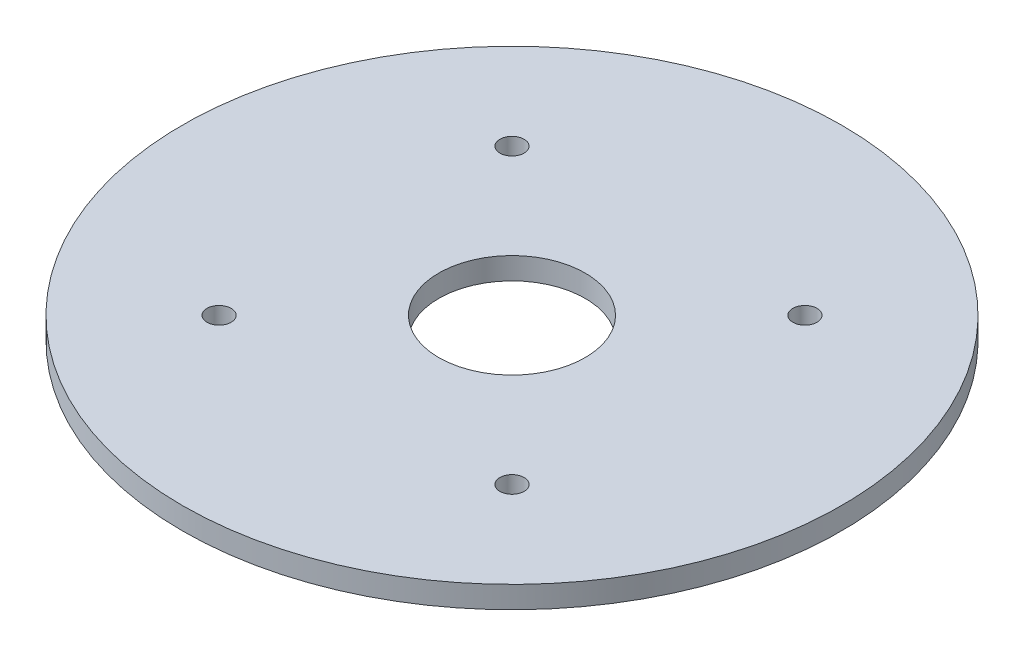
ISO-10303-21;
HEADER;
FILE_DESCRIPTION(('STEP AP214'),'2;1');
FILE_NAME('part.step','',(''),(''),'','','');
FILE_SCHEMA(('AUTOMOTIVE_DESIGN { 1 0 10303 214 1 1 1 1 }'));
ENDSEC;
DATA;
#1=APPLICATION_CONTEXT('core data for automotive mechanical design processes');
#2=APPLICATION_PROTOCOL_DEFINITION('international standard','automotive_design',2000,#1);
#3=PRODUCT_CONTEXT('',#1,'mechanical');
#4=PRODUCT('Part','Part','',(#3));
#5=PRODUCT_RELATED_PRODUCT_CATEGORY('part','',(#4));
#6=PRODUCT_DEFINITION_FORMATION('','',#4);
#7=PRODUCT_DEFINITION_CONTEXT('part definition',#1,'design');
#8=PRODUCT_DEFINITION('design','',#6,#7);
#9=PRODUCT_DEFINITION_SHAPE('','',#8);
#10=(LENGTH_UNIT() NAMED_UNIT(*) SI_UNIT(.MILLI.,.METRE.));
#11=(NAMED_UNIT(*) PLANE_ANGLE_UNIT() SI_UNIT($,.RADIAN.));
#12=(NAMED_UNIT(*) SI_UNIT($,.STERADIAN.) SOLID_ANGLE_UNIT());
#13=UNCERTAINTY_MEASURE_WITH_UNIT(LENGTH_MEASURE(1.E-05),#10,'distance_accuracy_value','');
#14=(GEOMETRIC_REPRESENTATION_CONTEXT(3) GLOBAL_UNCERTAINTY_ASSIGNED_CONTEXT((#13)) GLOBAL_UNIT_ASSIGNED_CONTEXT((#10,
#11,#12)) REPRESENTATION_CONTEXT('',''));
#15=CARTESIAN_POINT('',(0.,0.,0.));
#16=DIRECTION('',(0.,0.,1.));
#17=DIRECTION('',(1.,0.,0.));
#18=AXIS2_PLACEMENT_3D('',#15,#16,#17);
#19=CARTESIAN_POINT('',(0.,1.5,0.));
#20=DIRECTION('',(0.,1.,0.));
#21=DIRECTION('',(0.,0.,1.));
#22=AXIS2_PLACEMENT_3D('',#19,#20,#21);
#23=PLANE('',#22);
#24=CARTESIAN_POINT('',(20.,1.5,20.));
#25=DIRECTION('',(0.,1.,0.));
#26=DIRECTION('',(0.,0.,1.));
#27=AXIS2_PLACEMENT_3D('',#24,#25,#26);
#28=CIRCLE('',#27,1.65);
#29=CARTESIAN_POINT('',(20.,1.5,21.65));
#30=VERTEX_POINT('',#29);
#31=EDGE_CURVE('E96',#30,#30,#28,.T.);
#32=ORIENTED_EDGE('',*,*,#31,.F.);
#33=EDGE_LOOP('',(#32));
#34=FACE_BOUND('',#33,.T.);
#35=CARTESIAN_POINT('',(20.,1.5,-20.));
#36=DIRECTION('',(0.,1.,0.));
#37=DIRECTION('',(0.,0.,1.));
#38=AXIS2_PLACEMENT_3D('',#35,#36,#37);
#39=CIRCLE('',#38,1.65);
#40=CARTESIAN_POINT('',(20.,1.5,-18.35));
#41=VERTEX_POINT('',#40);
#42=EDGE_CURVE('E99',#41,#41,#39,.T.);
#43=ORIENTED_EDGE('',*,*,#42,.F.);
#44=EDGE_LOOP('',(#43));
#45=FACE_BOUND('',#44,.T.);
#46=CARTESIAN_POINT('',(-20.,1.5,-20.));
#47=DIRECTION('',(0.,1.,0.));
#48=DIRECTION('',(0.,0.,1.));
#49=AXIS2_PLACEMENT_3D('',#46,#47,#48);
#50=CIRCLE('',#49,1.65);
#51=CARTESIAN_POINT('',(-20.,1.5,-18.35));
#52=VERTEX_POINT('',#51);
#53=EDGE_CURVE('E95',#52,#52,#50,.T.);
#54=ORIENTED_EDGE('',*,*,#53,.F.);
#55=EDGE_LOOP('',(#54));
#56=FACE_BOUND('',#55,.T.);
#57=CARTESIAN_POINT('',(-20.,1.5,20.));
#58=DIRECTION('',(0.,1.,0.));
#59=DIRECTION('',(0.,0.,1.));
#60=AXIS2_PLACEMENT_3D('',#57,#58,#59);
#61=CIRCLE('',#60,1.65);
#62=CARTESIAN_POINT('',(-20.,1.5,21.65));
#63=VERTEX_POINT('',#62);
#64=EDGE_CURVE('E69',#63,#63,#61,.T.);
#65=ORIENTED_EDGE('',*,*,#64,.F.);
#66=EDGE_LOOP('',(#65));
#67=FACE_BOUND('',#66,.T.);
#68=CARTESIAN_POINT('',(0.,1.5,0.));
#69=DIRECTION('',(0.,1.,0.));
#70=DIRECTION('',(0.,0.,1.));
#71=AXIS2_PLACEMENT_3D('',#68,#69,#70);
#72=CIRCLE('',#71,45.);
#73=CARTESIAN_POINT('',(0.,1.5,45.));
#74=VERTEX_POINT('',#73);
#75=EDGE_CURVE('E10',#74,#74,#72,.T.);
#76=ORIENTED_EDGE('',*,*,#75,.T.);
#77=EDGE_LOOP('',(#76));
#78=FACE_BOUND('',#77,.T.);
#79=CARTESIAN_POINT('',(0.,1.5,0.));
#80=DIRECTION('',(0.,1.,0.));
#81=DIRECTION('',(0.,0.,1.));
#82=AXIS2_PLACEMENT_3D('',#79,#80,#81);
#83=CIRCLE('',#82,10.);
#84=CARTESIAN_POINT('',(0.,1.5,10.));
#85=VERTEX_POINT('',#84);
#86=EDGE_CURVE('E58',#85,#85,#83,.T.);
#87=ORIENTED_EDGE('',*,*,#86,.F.);
#88=EDGE_LOOP('',(#87));
#89=FACE_BOUND('',#88,.T.);
#90=ADVANCED_FACE('F42',(#34,#45,#56,#67,#78,#89),#23,.T.);
#91=CARTESIAN_POINT('',(0.,-1.5,0.));
#92=DIRECTION('',(0.,1.,0.));
#93=DIRECTION('',(0.,0.,1.));
#94=AXIS2_PLACEMENT_3D('',#91,#92,#93);
#95=PLANE('',#94);
#96=CARTESIAN_POINT('',(20.,-1.5,20.));
#97=DIRECTION('',(0.,1.,0.));
#98=DIRECTION('',(0.,0.,1.));
#99=AXIS2_PLACEMENT_3D('',#96,#97,#98);
#100=CIRCLE('',#99,1.65);
#101=CARTESIAN_POINT('',(20.,-1.5,21.65));
#102=VERTEX_POINT('',#101);
#103=EDGE_CURVE('E46',#102,#102,#100,.T.);
#104=ORIENTED_EDGE('',*,*,#103,.T.);
#105=EDGE_LOOP('',(#104));
#106=FACE_BOUND('',#105,.T.);
#107=CARTESIAN_POINT('',(20.,-1.5,-20.));
#108=DIRECTION('',(0.,1.,0.));
#109=DIRECTION('',(0.,0.,1.));
#110=AXIS2_PLACEMENT_3D('',#107,#108,#109);
#111=CIRCLE('',#110,1.65);
#112=CARTESIAN_POINT('',(20.,-1.5,-18.35));
#113=VERTEX_POINT('',#112);
#114=EDGE_CURVE('E72',#113,#113,#111,.T.);
#115=ORIENTED_EDGE('',*,*,#114,.T.);
#116=EDGE_LOOP('',(#115));
#117=FACE_BOUND('',#116,.T.);
#118=CARTESIAN_POINT('',(-20.,-1.5,-20.));
#119=DIRECTION('',(0.,1.,0.));
#120=DIRECTION('',(0.,0.,1.));
#121=AXIS2_PLACEMENT_3D('',#118,#119,#120);
#122=CIRCLE('',#121,1.65);
#123=CARTESIAN_POINT('',(-20.,-1.5,-18.35));
#124=VERTEX_POINT('',#123);
#125=EDGE_CURVE('E68',#124,#124,#122,.T.);
#126=ORIENTED_EDGE('',*,*,#125,.T.);
#127=EDGE_LOOP('',(#126));
#128=FACE_BOUND('',#127,.T.);
#129=CARTESIAN_POINT('',(-20.,-1.5,20.));
#130=DIRECTION('',(0.,1.,0.));
#131=DIRECTION('',(0.,0.,1.));
#132=AXIS2_PLACEMENT_3D('',#129,#130,#131);
#133=CIRCLE('',#132,1.65);
#134=CARTESIAN_POINT('',(-20.,-1.5,21.65));
#135=VERTEX_POINT('',#134);
#136=EDGE_CURVE('E64',#135,#135,#133,.T.);
#137=ORIENTED_EDGE('',*,*,#136,.T.);
#138=EDGE_LOOP('',(#137));
#139=FACE_BOUND('',#138,.T.);
#140=CARTESIAN_POINT('',(0.,-1.5,0.));
#141=DIRECTION('',(0.,1.,0.));
#142=DIRECTION('',(0.,0.,1.));
#143=AXIS2_PLACEMENT_3D('',#140,#141,#142);
#144=CIRCLE('',#143,45.);
#145=CARTESIAN_POINT('',(0.,-1.5,45.));
#146=VERTEX_POINT('',#145);
#147=EDGE_CURVE('E51',#146,#146,#144,.T.);
#148=ORIENTED_EDGE('',*,*,#147,.F.);
#149=EDGE_LOOP('',(#148));
#150=FACE_BOUND('',#149,.T.);
#151=CARTESIAN_POINT('',(0.,-1.5,0.));
#152=DIRECTION('',(0.,1.,0.));
#153=DIRECTION('',(0.,0.,1.));
#154=AXIS2_PLACEMENT_3D('',#151,#152,#153);
#155=CIRCLE('',#154,10.);
#156=CARTESIAN_POINT('',(0.,-1.5,10.));
#157=VERTEX_POINT('',#156);
#158=EDGE_CURVE('E61',#157,#157,#155,.T.);
#159=ORIENTED_EDGE('',*,*,#158,.T.);
#160=EDGE_LOOP('',(#159));
#161=FACE_BOUND('',#160,.T.);
#162=ADVANCED_FACE('F110',(#106,#117,#128,#139,#150,#161),#95,.F.);
#163=CARTESIAN_POINT('',(0.,1.5,0.));
#164=DIRECTION('',(0.,-1.,0.));
#165=DIRECTION('',(0.,0.,-1.));
#166=AXIS2_PLACEMENT_3D('',#163,#164,#165);
#167=CYLINDRICAL_SURFACE('',#166,45.);
#168=ORIENTED_EDGE('',*,*,#75,.F.);
#169=EDGE_LOOP('',(#168));
#170=FACE_BOUND('',#169,.T.);
#171=ORIENTED_EDGE('',*,*,#147,.T.);
#172=EDGE_LOOP('',(#171));
#173=FACE_BOUND('',#172,.T.);
#174=ADVANCED_FACE('F44',(#170,#173),#167,.T.);
#175=CARTESIAN_POINT('',(0.,1.5,0.));
#176=DIRECTION('',(0.,-1.,0.));
#177=DIRECTION('',(0.,0.,-1.));
#178=AXIS2_PLACEMENT_3D('',#175,#176,#177);
#179=CYLINDRICAL_SURFACE('',#178,10.);
#180=ORIENTED_EDGE('',*,*,#86,.T.);
#181=EDGE_LOOP('',(#180));
#182=FACE_BOUND('',#181,.T.);
#183=ORIENTED_EDGE('',*,*,#158,.F.);
#184=EDGE_LOOP('',(#183));
#185=FACE_BOUND('',#184,.T.);
#186=ADVANCED_FACE('F119',(#182,#185),#179,.F.);
#187=CARTESIAN_POINT('',(-20.,-8.5,20.));
#188=DIRECTION('',(0.,1.,0.));
#189=DIRECTION('',(0.,0.,1.));
#190=AXIS2_PLACEMENT_3D('',#187,#188,#189);
#191=CYLINDRICAL_SURFACE('',#190,1.65);
#192=ORIENTED_EDGE('',*,*,#64,.T.);
#193=EDGE_LOOP('',(#192));
#194=FACE_BOUND('',#193,.T.);
#195=ORIENTED_EDGE('',*,*,#136,.F.);
#196=EDGE_LOOP('',(#195));
#197=FACE_BOUND('',#196,.T.);
#198=ADVANCED_FACE('F116',(#194,#197),#191,.F.);
#199=CARTESIAN_POINT('',(-20.,-8.5,-20.));
#200=DIRECTION('',(0.,1.,0.));
#201=DIRECTION('',(0.,0.,1.));
#202=AXIS2_PLACEMENT_3D('',#199,#200,#201);
#203=CYLINDRICAL_SURFACE('',#202,1.65);
#204=ORIENTED_EDGE('',*,*,#53,.T.);
#205=EDGE_LOOP('',(#204));
#206=FACE_BOUND('',#205,.T.);
#207=ORIENTED_EDGE('',*,*,#125,.F.);
#208=EDGE_LOOP('',(#207));
#209=FACE_BOUND('',#208,.T.);
#210=ADVANCED_FACE('F105',(#206,#209),#203,.F.);
#211=CARTESIAN_POINT('',(20.,-8.5,-20.));
#212=DIRECTION('',(0.,1.,0.));
#213=DIRECTION('',(0.,0.,1.));
#214=AXIS2_PLACEMENT_3D('',#211,#212,#213);
#215=CYLINDRICAL_SURFACE('',#214,1.65);
#216=ORIENTED_EDGE('',*,*,#42,.T.);
#217=EDGE_LOOP('',(#216));
#218=FACE_BOUND('',#217,.T.);
#219=ORIENTED_EDGE('',*,*,#114,.F.);
#220=EDGE_LOOP('',(#219));
#221=FACE_BOUND('',#220,.T.);
#222=ADVANCED_FACE('F140',(#218,#221),#215,.F.);
#223=CARTESIAN_POINT('',(20.,-8.5,20.));
#224=DIRECTION('',(0.,1.,0.));
#225=DIRECTION('',(0.,0.,1.));
#226=AXIS2_PLACEMENT_3D('',#223,#224,#225);
#227=CYLINDRICAL_SURFACE('',#226,1.65);
#228=ORIENTED_EDGE('',*,*,#31,.T.);
#229=EDGE_LOOP('',(#228));
#230=FACE_BOUND('',#229,.T.);
#231=ORIENTED_EDGE('',*,*,#103,.F.);
#232=EDGE_LOOP('',(#231));
#233=FACE_BOUND('',#232,.T.);
#234=ADVANCED_FACE('F137',(#230,#233),#227,.F.);
#235=CLOSED_SHELL('',(#90,#162,#174,#186,#198,#210,#222,#234));
#236=MANIFOLD_SOLID_BREP('B2',#235);
#237=ADVANCED_BREP_SHAPE_REPRESENTATION('',(#18,#236),#14);
#238=SHAPE_DEFINITION_REPRESENTATION(#9,#237);
ENDSEC;
END-ISO-10303-21;
